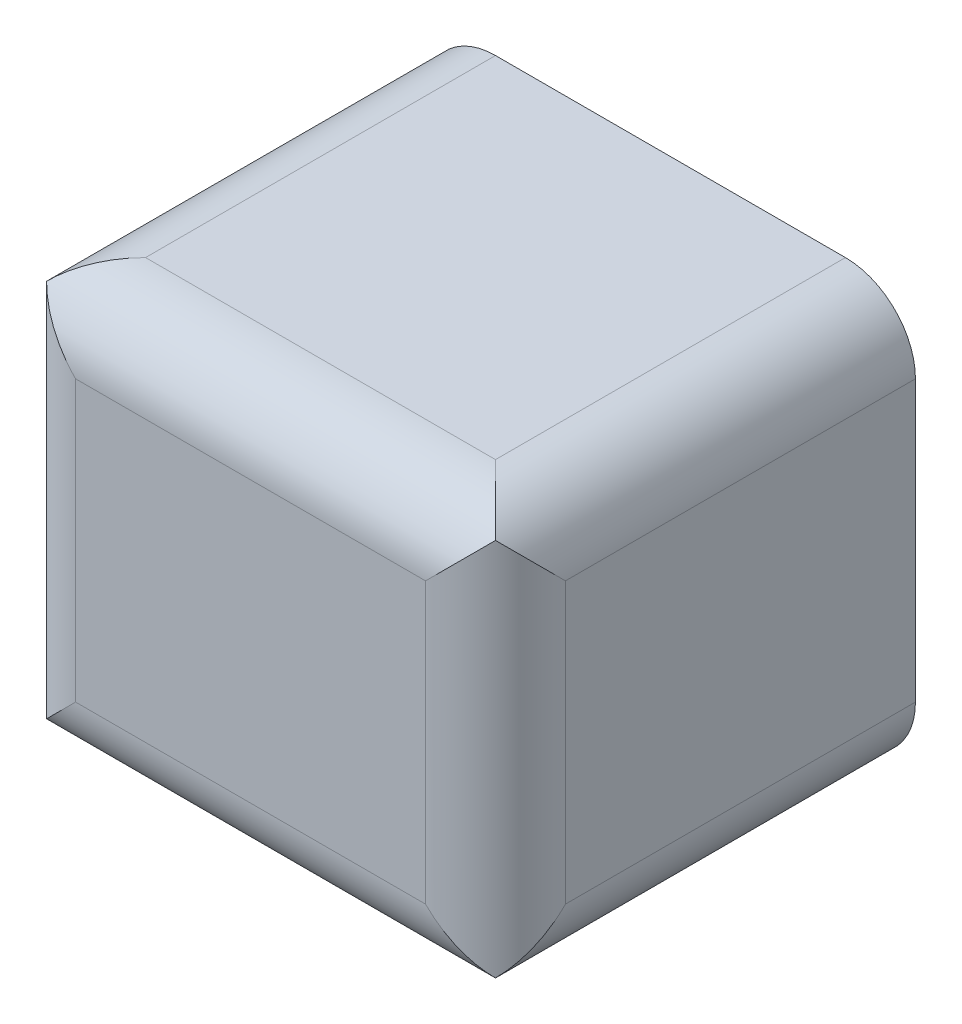
ISO-10303-21;
HEADER;
FILE_DESCRIPTION(('STEP AP214'),'2;1');
FILE_NAME('part.step','',(''),(''),'','','');
FILE_SCHEMA(('AUTOMOTIVE_DESIGN { 1 0 10303 214 1 1 1 1 }'));
ENDSEC;
DATA;
#1=APPLICATION_CONTEXT('core data for automotive mechanical design processes');
#2=APPLICATION_PROTOCOL_DEFINITION('international standard','automotive_design',2000,#1);
#3=PRODUCT_CONTEXT('',#1,'mechanical');
#4=PRODUCT('Part','Part','',(#3));
#5=PRODUCT_RELATED_PRODUCT_CATEGORY('part','',(#4));
#6=PRODUCT_DEFINITION_FORMATION('','',#4);
#7=PRODUCT_DEFINITION_CONTEXT('part definition',#1,'design');
#8=PRODUCT_DEFINITION('design','',#6,#7);
#9=PRODUCT_DEFINITION_SHAPE('','',#8);
#10=(LENGTH_UNIT() NAMED_UNIT(*) SI_UNIT(.MILLI.,.METRE.));
#11=(NAMED_UNIT(*) PLANE_ANGLE_UNIT() SI_UNIT($,.RADIAN.));
#12=(NAMED_UNIT(*) SI_UNIT($,.STERADIAN.) SOLID_ANGLE_UNIT());
#13=UNCERTAINTY_MEASURE_WITH_UNIT(LENGTH_MEASURE(1.E-05),#10,'distance_accuracy_value','');
#14=(GEOMETRIC_REPRESENTATION_CONTEXT(3) GLOBAL_UNCERTAINTY_ASSIGNED_CONTEXT((#13)) GLOBAL_UNIT_ASSIGNED_CONTEXT((#10,
#11,#12)) REPRESENTATION_CONTEXT('',''));
#15=CARTESIAN_POINT('',(0.,0.,0.));
#16=DIRECTION('',(0.,0.,1.));
#17=DIRECTION('',(1.,0.,0.));
#18=AXIS2_PLACEMENT_3D('',#15,#16,#17);
#19=CARTESIAN_POINT('',(10.5622845338479,18.6560500773611,4.46301460303631));
#20=DIRECTION('',(-1.,4.37113882867399E-08,-4.37114091299599E-08));
#21=DIRECTION('',(4.37113882867399E-08,1.,0.));
#22=AXIS2_PLACEMENT_3D('',#19,#20,#21);
#23=CYLINDRICAL_SURFACE('',#22,0.1);
#24=CARTESIAN_POINT('',(11.1622845338479,18.6560500511343,4.46301462926315));
#25=DIRECTION('',(0.707106750277928,-0.707106812095166,3.09086338110142E-08));
#26=DIRECTION('',(0.707106812095166,0.707106750277928,3.09086338110142E-08));
#27=AXIS2_PLACEMENT_3D('',#24,#25,#26);
#28=ELLIPSE('',#27,0.1414213562,0.1);
#29=CARTESIAN_POINT('',(11.2329952119669,18.7267607261624,4.53372531047302));
#30=VERTEX_POINT('',#29);
#31=CARTESIAN_POINT('',(11.1622845294767,18.6560500511343,4.56301462926315));
#32=VERTEX_POINT('',#31);
#33=EDGE_CURVE('E142',#30,#32,#28,.T.);
#34=ORIENTED_EDGE('',*,*,#33,.F.);
#35=CARTESIAN_POINT('',(11.1622845338479,18.6560500511343,4.46301462926315));
#36=DIRECTION('',(0.707106812095181,-3.09086204236913E-08,-0.707106750277913));
#37=DIRECTION('',(0.707106750277913,-3.09086177215727E-08,0.707106812095181));
#38=AXIS2_PLACEMENT_3D('',#35,#36,#37);
#39=ELLIPSE('',#38,0.1414213562,0.1);
#40=CARTESIAN_POINT('',(11.162284538219,18.7560500511342,4.46301462926315));
#41=VERTEX_POINT('',#40);
#42=EDGE_CURVE('E140',#41,#30,#39,.T.);
#43=ORIENTED_EDGE('',*,*,#42,.F.);
#44=DIRECTION('',(1.,-4.37113882867399E-08,4.37114091299599E-08));
#45=VECTOR('',#44,1.);
#46=CARTESIAN_POINT('',(10.562284538219,18.7560500773611,4.46301460303631));
#47=LINE('',#46,#45);
#48=CARTESIAN_POINT('',(10.662284538219,18.7560500729899,4.46301460740745));
#49=VERTEX_POINT('',#48);
#50=EDGE_CURVE('E128',#49,#41,#47,.T.);
#51=ORIENTED_EDGE('',*,*,#50,.F.);
#52=CARTESIAN_POINT('',(10.6622845338479,18.6560500729899,4.46301460740745));
#53=DIRECTION('',(0.707106750277913,-3.09086177215727E-08,0.707106812095181));
#54=DIRECTION('',(0.707106812095181,-3.09086204236913E-08,-0.707106750277913));
#55=AXIS2_PLACEMENT_3D('',#52,#53,#54);
#56=ELLIPSE('',#55,0.1414213562,0.1);
#57=CARTESIAN_POINT('',(10.5915738557289,18.7267607541998,4.53372528243559));
#58=VERTEX_POINT('',#57);
#59=EDGE_CURVE('E11',#49,#58,#56,.T.);
#60=ORIENTED_EDGE('',*,*,#59,.T.);
#61=CARTESIAN_POINT('',(10.6622845338479,18.6560500729899,4.46301460740745));
#62=DIRECTION('',(0.707106812095166,0.707106750277928,3.09086338110142E-08));
#63=DIRECTION('',(0.707106750277928,-0.707106812095166,3.09086338110142E-08));
#64=AXIS2_PLACEMENT_3D('',#61,#62,#63);
#65=ELLIPSE('',#64,0.1414213562,0.1);
#66=CARTESIAN_POINT('',(10.6622845294767,18.6560500729899,4.56301460740745));
#67=VERTEX_POINT('',#66);
#68=EDGE_CURVE('E282',#58,#67,#65,.T.);
#69=ORIENTED_EDGE('',*,*,#68,.T.);
#70=DIRECTION('',(1.,-4.37113882867399E-08,4.37114091299599E-08));
#71=VECTOR('',#70,1.);
#72=CARTESIAN_POINT('',(10.5622845294767,18.6560500773611,4.56301460303631));
#73=LINE('',#72,#71);
#74=EDGE_CURVE('E273',#67,#32,#73,.T.);
#75=ORIENTED_EDGE('',*,*,#74,.T.);
#76=EDGE_LOOP('',(#34,#43,#51,#60,#69,#75));
#77=FACE_BOUND('',#76,.T.);
#78=ADVANCED_FACE('F17',(#77),#23,.T.);
#79=CARTESIAN_POINT('',(10.6622844945076,18.25605007299,4.96301460740745));
#80=DIRECTION('',(-4.37114091299598E-08,0.,1.));
#81=DIRECTION('',(1.,-4.37113882867399E-08,4.37114091299599E-08));
#82=AXIS2_PLACEMENT_3D('',#79,#80,#81);
#83=CYLINDRICAL_SURFACE('',#82,0.1);
#84=DIRECTION('',(4.37114091299598E-08,0.,-1.));
#85=VECTOR('',#84,1.);
#86=CARTESIAN_POINT('',(10.6622844901365,18.1560500729899,4.96301460740745));
#87=LINE('',#86,#85);
#88=CARTESIAN_POINT('',(10.6622845119922,18.1560500729899,4.46301460740745));
#89=VERTEX_POINT('',#88);
#90=CARTESIAN_POINT('',(10.6622845338479,18.1560500729899,3.96301460740745));
#91=VERTEX_POINT('',#90);
#92=EDGE_CURVE('E194',#89,#91,#87,.T.);
#93=ORIENTED_EDGE('',*,*,#92,.F.);
#94=CARTESIAN_POINT('',(10.6622845163633,18.25605007299,4.46301460740745));
#95=DIRECTION('',(0.707106750277913,-3.09086177215727E-08,0.707106812095181));
#96=DIRECTION('',(0.707106812095181,-3.09086204236913E-08,-0.707106750277913));
#97=AXIS2_PLACEMENT_3D('',#94,#95,#96);
#98=ELLIPSE('',#97,0.1414213562,0.1);
#99=CARTESIAN_POINT('',(10.5915738320626,18.1853393979619,4.53372528243559));
#100=VERTEX_POINT('',#99);
#101=EDGE_CURVE('E267',#100,#89,#98,.T.);
#102=ORIENTED_EDGE('',*,*,#101,.F.);
#103=CARTESIAN_POINT('',(10.6622845163633,18.25605007299,4.46301460740745));
#104=DIRECTION('',(0.,0.707106781186549,0.707106781186547));
#105=DIRECTION('',(6.18172528836462E-08,0.707106781186546,-0.707106781186547));
#106=AXIS2_PLACEMENT_3D('',#103,#104,#105);
#107=ELLIPSE('',#106,0.1414213562,0.1);
#108=CARTESIAN_POINT('',(10.5622845163633,18.2560500773611,4.46301460303631));
#109=VERTEX_POINT('',#108);
#110=EDGE_CURVE('E302',#109,#100,#107,.T.);
#111=ORIENTED_EDGE('',*,*,#110,.F.);
#112=DIRECTION('',(4.37114091299598E-08,0.,-1.));
#113=VECTOR('',#112,1.);
#114=CARTESIAN_POINT('',(10.5622844945076,18.2560500773611,4.96301460303631));
#115=LINE('',#114,#113);
#116=CARTESIAN_POINT('',(10.562284538219,18.2560500773611,3.96301460303631));
#117=VERTEX_POINT('',#116);
#118=EDGE_CURVE('E234',#109,#117,#115,.T.);
#119=ORIENTED_EDGE('',*,*,#118,.T.);
#120=CARTESIAN_POINT('',(10.662284538219,18.25605007299,3.96301460740745));
#121=DIRECTION('',(-4.37114091299598E-08,0.,1.));
#122=DIRECTION('',(-1.,4.37113882867399E-08,-4.37114091299599E-08));
#123=AXIS2_PLACEMENT_3D('',#120,#121,#122);
#124=CIRCLE('',#123,0.1);
#125=EDGE_CURVE('E182',#117,#91,#124,.T.);
#126=ORIENTED_EDGE('',*,*,#125,.T.);
#127=EDGE_LOOP('',(#93,#102,#111,#119,#126));
#128=FACE_BOUND('',#127,.T.);
#129=ADVANCED_FACE('F394',(#128),#83,.T.);
#130=CARTESIAN_POINT('',(10.6622845119922,18.6560500729899,4.96301460740745));
#131=DIRECTION('',(-4.37114091299598E-08,0.,1.));
#132=DIRECTION('',(1.,-4.37113882867399E-08,4.37114091299599E-08));
#133=AXIS2_PLACEMENT_3D('',#130,#131,#132);
#134=CYLINDRICAL_SURFACE('',#133,0.1);
#135=DIRECTION('',(4.37114091299598E-08,0.,-1.));
#136=VECTOR('',#135,1.);
#137=CARTESIAN_POINT('',(10.5622845119922,18.6560500773611,4.96301460303631));
#138=LINE('',#137,#136);
#139=CARTESIAN_POINT('',(10.5622845338479,18.6560500773611,4.46301460303631));
#140=VERTEX_POINT('',#139);
#141=CARTESIAN_POINT('',(10.5622845557036,18.6560500773611,3.96301460303631));
#142=VERTEX_POINT('',#141);
#143=EDGE_CURVE('E261',#140,#142,#138,.T.);
#144=ORIENTED_EDGE('',*,*,#143,.F.);
#145=CARTESIAN_POINT('',(10.6622845338479,18.6560500729899,4.46301460740745));
#146=DIRECTION('',(6.18172528836462E-08,0.707106781186546,-0.707106781186547));
#147=DIRECTION('',(0.,0.707106781186549,0.707106781186547));
#148=AXIS2_PLACEMENT_3D('',#145,#146,#147);
#149=ELLIPSE('',#148,0.1414213562,0.1);
#150=EDGE_CURVE('E27',#140,#58,#149,.T.);
#151=ORIENTED_EDGE('',*,*,#150,.T.);
#152=ORIENTED_EDGE('',*,*,#59,.F.);
#153=DIRECTION('',(4.37114091299598E-08,0.,-1.));
#154=VECTOR('',#153,1.);
#155=CARTESIAN_POINT('',(10.6622845163633,18.7560500729899,4.96301460740745));
#156=LINE('',#155,#154);
#157=CARTESIAN_POINT('',(10.6622845600747,18.7560500729899,3.96301460740745));
#158=VERTEX_POINT('',#157);
#159=EDGE_CURVE('E135',#49,#158,#156,.T.);
#160=ORIENTED_EDGE('',*,*,#159,.T.);
#161=CARTESIAN_POINT('',(10.6622845557036,18.6560500729899,3.96301460740745));
#162=DIRECTION('',(-4.37114091299598E-08,0.,1.));
#163=DIRECTION('',(-1.,4.37113882867399E-08,-4.37114091299599E-08));
#164=AXIS2_PLACEMENT_3D('',#161,#162,#163);
#165=CIRCLE('',#164,0.1);
#166=EDGE_CURVE('E195',#158,#142,#165,.T.);
#167=ORIENTED_EDGE('',*,*,#166,.T.);
#168=EDGE_LOOP('',(#144,#151,#152,#160,#167));
#169=FACE_BOUND('',#168,.T.);
#170=ADVANCED_FACE('F352',(#169),#134,.T.);
#171=CARTESIAN_POINT('',(10.6622844813942,17.4560500729899,4.46301460740745));
#172=DIRECTION('',(-4.37113882867399E-08,-1.,0.));
#173=DIRECTION('',(-1.,4.37113882867399E-08,-4.37114091299599E-08));
#174=AXIS2_PLACEMENT_3D('',#171,#172,#173);
#175=CYLINDRICAL_SURFACE('',#174,0.1);
#176=DIRECTION('',(4.37113882867399E-08,1.,0.));
#177=VECTOR('',#176,1.);
#178=CARTESIAN_POINT('',(10.5622844813942,17.4560500773611,4.46301460303631));
#179=LINE('',#178,#177);
#180=EDGE_CURVE('E257',#109,#140,#179,.T.);
#181=ORIENTED_EDGE('',*,*,#180,.F.);
#182=ORIENTED_EDGE('',*,*,#110,.T.);
#183=CARTESIAN_POINT('',(10.6622845163633,18.25605007299,4.46301460740745));
#184=DIRECTION('',(0.707106750277928,-0.707106812095166,3.09086338110142E-08));
#185=DIRECTION('',(0.707106812095166,0.707106750277928,3.09086338110142E-08));
#186=AXIS2_PLACEMENT_3D('',#183,#184,#185);
#187=ELLIPSE('',#186,0.1414213562,0.1);
#188=CARTESIAN_POINT('',(10.6622845119922,18.25605007299,4.56301460740745));
#189=VERTEX_POINT('',#188);
#190=EDGE_CURVE('E208',#189,#100,#187,.T.);
#191=ORIENTED_EDGE('',*,*,#190,.F.);
#192=DIRECTION('',(4.37113882867399E-08,1.,0.));
#193=VECTOR('',#192,1.);
#194=CARTESIAN_POINT('',(10.6622844770231,17.4560500729899,4.56301460740745));
#195=LINE('',#194,#193);
#196=EDGE_CURVE('E245',#189,#67,#195,.T.);
#197=ORIENTED_EDGE('',*,*,#196,.T.);
#198=ORIENTED_EDGE('',*,*,#68,.F.);
#199=ORIENTED_EDGE('',*,*,#150,.F.);
#200=EDGE_LOOP('',(#181,#182,#191,#197,#198,#199));
#201=FACE_BOUND('',#200,.T.);
#202=ADVANCED_FACE('F380',(#201),#175,.T.);
#203=CARTESIAN_POINT('',(11.1622844813942,17.4560500511343,4.46301462926315));
#204=DIRECTION('',(-4.37113882867399E-08,-1.,0.));
#205=DIRECTION('',(-1.,4.37113882867399E-08,-4.37114091299599E-08));
#206=AXIS2_PLACEMENT_3D('',#203,#204,#205);
#207=CYLINDRICAL_SURFACE('',#206,0.1);
#208=DIRECTION('',(4.37113882867399E-08,1.,0.));
#209=VECTOR('',#208,1.);
#210=CARTESIAN_POINT('',(11.2622844813942,17.4560500467631,4.46301463363429));
#211=LINE('',#210,#209);
#212=CARTESIAN_POINT('',(11.2622845163633,18.2560500467631,4.46301463363429));
#213=VERTEX_POINT('',#212);
#214=CARTESIAN_POINT('',(11.2622845338479,18.6560500467631,4.46301463363429));
#215=VERTEX_POINT('',#214);
#216=EDGE_CURVE('E231',#213,#215,#211,.T.);
#217=ORIENTED_EDGE('',*,*,#216,.T.);
#218=CARTESIAN_POINT('',(11.1622845338479,18.6560500511343,4.46301462926315));
#219=DIRECTION('',(6.18172528836462E-08,0.707106781186546,-0.707106781186547));
#220=DIRECTION('',(0.,0.707106781186549,0.707106781186547));
#221=AXIS2_PLACEMENT_3D('',#218,#219,#220);
#222=ELLIPSE('',#221,0.1414213562,0.1);
#223=EDGE_CURVE('E147',#30,#215,#222,.T.);
#224=ORIENTED_EDGE('',*,*,#223,.F.);
#225=ORIENTED_EDGE('',*,*,#33,.T.);
#226=DIRECTION('',(4.37113882867399E-08,1.,0.));
#227=VECTOR('',#226,1.);
#228=CARTESIAN_POINT('',(11.1622844770231,17.4560500511343,4.56301462926315));
#229=LINE('',#228,#227);
#230=CARTESIAN_POINT('',(11.1622845119922,18.2560500511342,4.56301462926315));
#231=VERTEX_POINT('',#230);
#232=EDGE_CURVE('E235',#231,#32,#229,.T.);
#233=ORIENTED_EDGE('',*,*,#232,.F.);
#234=CARTESIAN_POINT('',(11.1622845163633,18.2560500511342,4.46301462926315));
#235=DIRECTION('',(0.707106812095166,0.707106750277928,3.09086338110142E-08));
#236=DIRECTION('',(0.707106750277928,-0.707106812095166,3.09086338110142E-08));
#237=AXIS2_PLACEMENT_3D('',#234,#235,#236);
#238=ELLIPSE('',#237,0.1414213562,0.1);
#239=CARTESIAN_POINT('',(11.2329951883006,18.1853393699244,4.53372531047302));
#240=VERTEX_POINT('',#239);
#241=EDGE_CURVE('E209',#231,#240,#238,.T.);
#242=ORIENTED_EDGE('',*,*,#241,.T.);
#243=CARTESIAN_POINT('',(11.1622845163633,18.2560500511342,4.46301462926315));
#244=DIRECTION('',(0.,0.707106781186549,0.707106781186547));
#245=DIRECTION('',(6.18172528836462E-08,0.707106781186546,-0.707106781186547));
#246=AXIS2_PLACEMENT_3D('',#243,#244,#245);
#247=ELLIPSE('',#246,0.1414213562,0.1);
#248=EDGE_CURVE('E201',#240,#213,#247,.T.);
#249=ORIENTED_EDGE('',*,*,#248,.T.);
#250=EDGE_LOOP('',(#217,#224,#225,#233,#242,#249));
#251=FACE_BOUND('',#250,.T.);
#252=ADVANCED_FACE('F339',(#251),#207,.T.);
#253=CARTESIAN_POINT('',(10.5622845338479,18.6560500773611,4.46301460303631));
#254=DIRECTION('',(-1.,4.37113882867399E-08,-4.37114091299599E-08));
#255=DIRECTION('',(-4.37113882867399E-08,-1.,0.));
#256=AXIS2_PLACEMENT_3D('',#253,#254,#255);
#257=PLANE('',#256);
#258=DIRECTION('',(-4.37113882867399E-08,-1.,0.));
#259=VECTOR('',#258,1.);
#260=CARTESIAN_POINT('',(10.5622845600747,18.7560500773611,3.96301460303631));
#261=LINE('',#260,#259);
#262=EDGE_CURVE('E225',#142,#117,#261,.T.);
#263=ORIENTED_EDGE('',*,*,#262,.T.);
#264=ORIENTED_EDGE('',*,*,#118,.F.);
#265=ORIENTED_EDGE('',*,*,#180,.T.);
#266=ORIENTED_EDGE('',*,*,#143,.T.);
#267=EDGE_LOOP('',(#263,#264,#265,#266));
#268=FACE_BOUND('',#267,.T.);
#269=ADVANCED_FACE('F397',(#268),#257,.T.);
#270=CARTESIAN_POINT('',(11.2622845338479,18.6560500467631,4.46301463363429));
#271=DIRECTION('',(-1.,4.37113882867399E-08,-4.37114091299599E-08));
#272=DIRECTION('',(-4.37113882867399E-08,-1.,0.));
#273=AXIS2_PLACEMENT_3D('',#270,#271,#272);
#274=PLANE('',#273);
#275=DIRECTION('',(-4.37113882867399E-08,-1.,0.));
#276=VECTOR('',#275,1.);
#277=CARTESIAN_POINT('',(11.2622845600747,18.7560500467631,3.9630146336343));
#278=LINE('',#277,#276);
#279=CARTESIAN_POINT('',(11.2622845557036,18.6560500467631,3.9630146336343));
#280=VERTEX_POINT('',#279);
#281=CARTESIAN_POINT('',(11.262284538219,18.2560500467631,3.9630146336343));
#282=VERTEX_POINT('',#281);
#283=EDGE_CURVE('E137',#280,#282,#278,.T.);
#284=ORIENTED_EDGE('',*,*,#283,.F.);
#285=DIRECTION('',(4.37114091299598E-08,0.,-1.));
#286=VECTOR('',#285,1.);
#287=CARTESIAN_POINT('',(11.2622845119922,18.6560500467631,4.96301463363429));
#288=LINE('',#287,#286);
#289=EDGE_CURVE('E170',#215,#280,#288,.T.);
#290=ORIENTED_EDGE('',*,*,#289,.F.);
#291=ORIENTED_EDGE('',*,*,#216,.F.);
#292=DIRECTION('',(4.37114091299598E-08,0.,-1.));
#293=VECTOR('',#292,1.);
#294=CARTESIAN_POINT('',(11.2622844945076,18.2560500467631,4.96301463363429));
#295=LINE('',#294,#293);
#296=EDGE_CURVE('E169',#213,#282,#295,.T.);
#297=ORIENTED_EDGE('',*,*,#296,.T.);
#298=EDGE_LOOP('',(#284,#290,#291,#297));
#299=FACE_BOUND('',#298,.T.);
#300=ADVANCED_FACE('F343',(#299),#274,.F.);
#301=CARTESIAN_POINT('',(10.5622845119922,18.2560500773611,4.56301460303631));
#302=DIRECTION('',(4.37114091299598E-08,0.,-1.));
#303=DIRECTION('',(1.,-4.37113882867399E-08,4.37114091299599E-08));
#304=AXIS2_PLACEMENT_3D('',#301,#302,#303);
#305=PLANE('',#304);
#306=ORIENTED_EDGE('',*,*,#74,.F.);
#307=ORIENTED_EDGE('',*,*,#196,.F.);
#308=DIRECTION('',(1.,-4.37113882867399E-08,4.37114091299599E-08));
#309=VECTOR('',#308,1.);
#310=CARTESIAN_POINT('',(10.5622845119922,18.2560500773611,4.56301460303631));
#311=LINE('',#310,#309);
#312=EDGE_CURVE('E204',#189,#231,#311,.T.);
#313=ORIENTED_EDGE('',*,*,#312,.T.);
#314=ORIENTED_EDGE('',*,*,#232,.T.);
#315=EDGE_LOOP('',(#306,#307,#313,#314));
#316=FACE_BOUND('',#315,.T.);
#317=ADVANCED_FACE('F334',(#316),#305,.F.);
#318=CARTESIAN_POINT('',(10.5622845163633,18.2560500773611,4.46301460303631));
#319=DIRECTION('',(-1.,4.37113882867399E-08,-4.37114091299599E-08));
#320=DIRECTION('',(4.37113882867399E-08,1.,0.));
#321=AXIS2_PLACEMENT_3D('',#318,#319,#320);
#322=CYLINDRICAL_SURFACE('',#321,0.1);
#323=DIRECTION('',(1.,-4.37113882867399E-08,4.37114091299599E-08));
#324=VECTOR('',#323,1.);
#325=CARTESIAN_POINT('',(10.5622845119922,18.1560500773611,4.46301460303631));
#326=LINE('',#325,#324);
#327=CARTESIAN_POINT('',(11.1622845119922,18.1560500511343,4.46301462926315));
#328=VERTEX_POINT('',#327);
#329=EDGE_CURVE('E191',#89,#328,#326,.T.);
#330=ORIENTED_EDGE('',*,*,#329,.T.);
#331=CARTESIAN_POINT('',(11.1622845163633,18.2560500511342,4.46301462926315));
#332=DIRECTION('',(0.707106812095181,-3.09086204236913E-08,-0.707106750277913));
#333=DIRECTION('',(0.707106750277913,-3.09086177215727E-08,0.707106812095181));
#334=AXIS2_PLACEMENT_3D('',#331,#332,#333);
#335=ELLIPSE('',#334,0.1414213562,0.1);
#336=EDGE_CURVE('E188',#240,#328,#335,.T.);
#337=ORIENTED_EDGE('',*,*,#336,.F.);
#338=ORIENTED_EDGE('',*,*,#241,.F.);
#339=ORIENTED_EDGE('',*,*,#312,.F.);
#340=ORIENTED_EDGE('',*,*,#190,.T.);
#341=ORIENTED_EDGE('',*,*,#101,.T.);
#342=EDGE_LOOP('',(#330,#337,#338,#339,#340,#341));
#343=FACE_BOUND('',#342,.T.);
#344=ADVANCED_FACE('F383',(#343),#322,.T.);
#345=CARTESIAN_POINT('',(10.5622845338479,18.1560500773611,3.96301460303631));
#346=DIRECTION('',(4.37113882867399E-08,1.,0.));
#347=DIRECTION('',(-1.,4.37113882867399E-08,-4.37114091299599E-08));
#348=AXIS2_PLACEMENT_3D('',#345,#346,#347);
#349=PLANE('',#348);
#350=DIRECTION('',(1.,-4.37113882867399E-08,4.37114091299599E-08));
#351=VECTOR('',#350,1.);
#352=CARTESIAN_POINT('',(10.5622845338479,18.1560500773611,3.96301460303631));
#353=LINE('',#352,#351);
#354=CARTESIAN_POINT('',(11.1622845338479,18.1560500511343,3.96301462926316));
#355=VERTEX_POINT('',#354);
#356=EDGE_CURVE('E179',#91,#355,#353,.T.);
#357=ORIENTED_EDGE('',*,*,#356,.T.);
#358=DIRECTION('',(4.37114091299598E-08,0.,-1.));
#359=VECTOR('',#358,1.);
#360=CARTESIAN_POINT('',(11.1622844901365,18.1560500511343,4.96301462926315));
#361=LINE('',#360,#359);
#362=EDGE_CURVE('E176',#328,#355,#361,.T.);
#363=ORIENTED_EDGE('',*,*,#362,.F.);
#364=ORIENTED_EDGE('',*,*,#329,.F.);
#365=ORIENTED_EDGE('',*,*,#92,.T.);
#366=EDGE_LOOP('',(#357,#363,#364,#365));
#367=FACE_BOUND('',#366,.T.);
#368=ADVANCED_FACE('F391',(#367),#349,.F.);
#369=CARTESIAN_POINT('',(10.5622845600747,18.7560500773611,3.96301460303631));
#370=DIRECTION('',(-4.37114091299598E-08,0.,1.));
#371=DIRECTION('',(-1.,4.37113882867399E-08,-4.37114091299599E-08));
#372=AXIS2_PLACEMENT_3D('',#369,#370,#371);
#373=PLANE('',#372);
#374=DIRECTION('',(1.,-4.37113882867399E-08,4.37114091299599E-08));
#375=VECTOR('',#374,1.);
#376=CARTESIAN_POINT('',(10.5622845600747,18.7560500773611,3.96301460303631));
#377=LINE('',#376,#375);
#378=CARTESIAN_POINT('',(11.1622845600747,18.7560500511342,3.96301462926316));
#379=VERTEX_POINT('',#378);
#380=EDGE_CURVE('E161',#158,#379,#377,.T.);
#381=ORIENTED_EDGE('',*,*,#380,.T.);
#382=CARTESIAN_POINT('',(11.1622845557036,18.6560500511343,3.96301462926316));
#383=DIRECTION('',(-4.37114091299598E-08,0.,1.));
#384=DIRECTION('',(-1.,4.37113882867399E-08,-4.37114091299599E-08));
#385=AXIS2_PLACEMENT_3D('',#382,#383,#384);
#386=CIRCLE('',#385,0.1);
#387=EDGE_CURVE('E153',#280,#379,#386,.T.);
#388=ORIENTED_EDGE('',*,*,#387,.F.);
#389=ORIENTED_EDGE('',*,*,#283,.T.);
#390=CARTESIAN_POINT('',(11.162284538219,18.2560500511342,3.96301462926316));
#391=DIRECTION('',(-4.37114091299598E-08,0.,1.));
#392=DIRECTION('',(-1.,4.37113882867399E-08,-4.37114091299599E-08));
#393=AXIS2_PLACEMENT_3D('',#390,#391,#392);
#394=CIRCLE('',#393,0.1);
#395=EDGE_CURVE('E164',#355,#282,#394,.T.);
#396=ORIENTED_EDGE('',*,*,#395,.F.);
#397=ORIENTED_EDGE('',*,*,#356,.F.);
#398=ORIENTED_EDGE('',*,*,#125,.F.);
#399=ORIENTED_EDGE('',*,*,#262,.F.);
#400=ORIENTED_EDGE('',*,*,#166,.F.);
#401=EDGE_LOOP('',(#381,#388,#389,#396,#397,#398,#399,#400));
#402=FACE_BOUND('',#401,.T.);
#403=ADVANCED_FACE('F347',(#402),#373,.F.);
#404=CARTESIAN_POINT('',(10.562284538219,18.7560500773611,4.46301460303631));
#405=DIRECTION('',(-4.37113882867399E-08,-1.,0.));
#406=DIRECTION('',(1.,-4.37113882867399E-08,4.37114091299599E-08));
#407=AXIS2_PLACEMENT_3D('',#404,#405,#406);
#408=PLANE('',#407);
#409=DIRECTION('',(4.37114091299598E-08,0.,-1.));
#410=VECTOR('',#409,1.);
#411=CARTESIAN_POINT('',(11.1622845163633,18.7560500511342,4.96301462926315));
#412=LINE('',#411,#410);
#413=EDGE_CURVE('E133',#41,#379,#412,.T.);
#414=ORIENTED_EDGE('',*,*,#413,.T.);
#415=ORIENTED_EDGE('',*,*,#380,.F.);
#416=ORIENTED_EDGE('',*,*,#159,.F.);
#417=ORIENTED_EDGE('',*,*,#50,.T.);
#418=EDGE_LOOP('',(#414,#415,#416,#417));
#419=FACE_BOUND('',#418,.T.);
#420=ADVANCED_FACE('F130',(#419),#408,.F.);
#421=CARTESIAN_POINT('',(11.1622844945076,18.2560500511342,4.96301462926315));
#422=DIRECTION('',(-4.37114091299598E-08,0.,1.));
#423=DIRECTION('',(1.,-4.37113882867399E-08,4.37114091299599E-08));
#424=AXIS2_PLACEMENT_3D('',#421,#422,#423);
#425=CYLINDRICAL_SURFACE('',#424,0.1);
#426=ORIENTED_EDGE('',*,*,#296,.F.);
#427=ORIENTED_EDGE('',*,*,#248,.F.);
#428=ORIENTED_EDGE('',*,*,#336,.T.);
#429=ORIENTED_EDGE('',*,*,#362,.T.);
#430=ORIENTED_EDGE('',*,*,#395,.T.);
#431=EDGE_LOOP('',(#426,#427,#428,#429,#430));
#432=FACE_BOUND('',#431,.T.);
#433=ADVANCED_FACE('F388',(#432),#425,.T.);
#434=CARTESIAN_POINT('',(11.1622845119922,18.6560500511343,4.96301462926315));
#435=DIRECTION('',(-4.37114091299598E-08,0.,1.));
#436=DIRECTION('',(1.,-4.37113882867399E-08,4.37114091299599E-08));
#437=AXIS2_PLACEMENT_3D('',#434,#435,#436);
#438=CYLINDRICAL_SURFACE('',#437,0.1);
#439=ORIENTED_EDGE('',*,*,#413,.F.);
#440=ORIENTED_EDGE('',*,*,#42,.T.);
#441=ORIENTED_EDGE('',*,*,#223,.T.);
#442=ORIENTED_EDGE('',*,*,#289,.T.);
#443=ORIENTED_EDGE('',*,*,#387,.T.);
#444=EDGE_LOOP('',(#439,#440,#441,#442,#443));
#445=FACE_BOUND('',#444,.T.);
#446=ADVANCED_FACE('F150',(#445),#438,.T.);
#447=CLOSED_SHELL('',(#78,#129,#170,#202,#252,#269,#300,#317,#344,#368,#403,#420,#433,#446));
#448=MANIFOLD_SOLID_BREP('B1',#447);
#449=ADVANCED_BREP_SHAPE_REPRESENTATION('',(#18,#448),#14);
#450=SHAPE_DEFINITION_REPRESENTATION(#9,#449);
ENDSEC;
END-ISO-10303-21;
